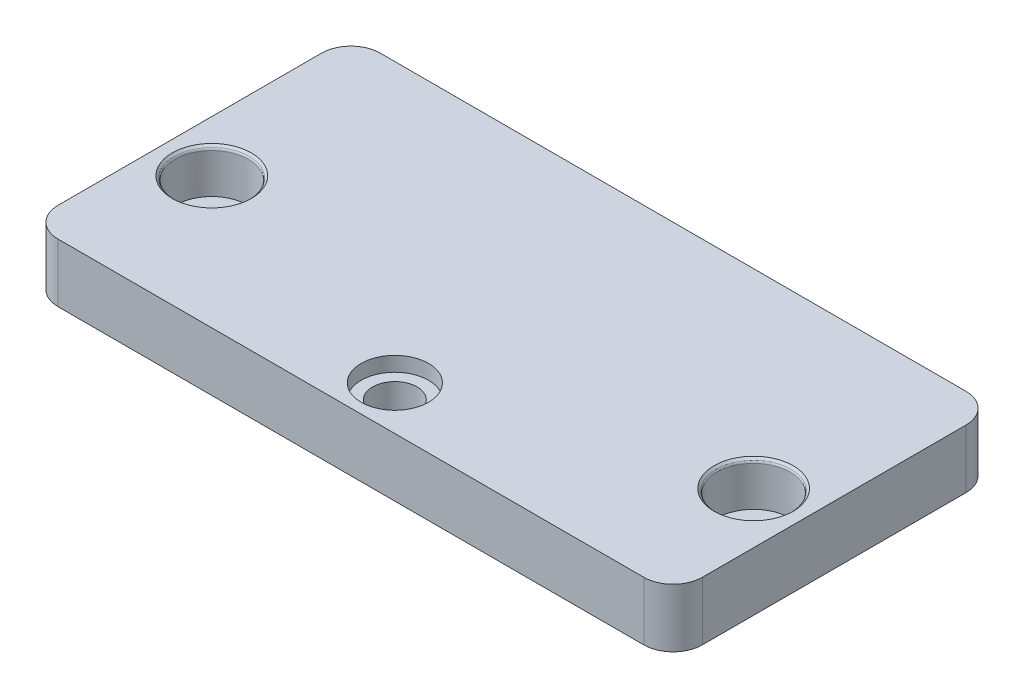
ISO-10303-21;
HEADER;
FILE_DESCRIPTION(('STEP AP214'),'2;1');
FILE_NAME('part.step','',(''),(''),'','','');
FILE_SCHEMA(('AUTOMOTIVE_DESIGN { 1 0 10303 214 1 1 1 1 }'));
ENDSEC;
DATA;
#1=APPLICATION_CONTEXT('core data for automotive mechanical design processes');
#2=APPLICATION_PROTOCOL_DEFINITION('international standard','automotive_design',2000,#1);
#3=PRODUCT_CONTEXT('',#1,'mechanical');
#4=PRODUCT('Part','Part','',(#3));
#5=PRODUCT_RELATED_PRODUCT_CATEGORY('part','',(#4));
#6=PRODUCT_DEFINITION_FORMATION('','',#4);
#7=PRODUCT_DEFINITION_CONTEXT('part definition',#1,'design');
#8=PRODUCT_DEFINITION('design','',#6,#7);
#9=PRODUCT_DEFINITION_SHAPE('','',#8);
#10=(LENGTH_UNIT() NAMED_UNIT(*) SI_UNIT(.MILLI.,.METRE.));
#11=(NAMED_UNIT(*) PLANE_ANGLE_UNIT() SI_UNIT($,.RADIAN.));
#12=(NAMED_UNIT(*) SI_UNIT($,.STERADIAN.) SOLID_ANGLE_UNIT());
#13=UNCERTAINTY_MEASURE_WITH_UNIT(LENGTH_MEASURE(1.E-05),#10,'distance_accuracy_value','');
#14=(GEOMETRIC_REPRESENTATION_CONTEXT(3) GLOBAL_UNCERTAINTY_ASSIGNED_CONTEXT((#13)) GLOBAL_UNIT_ASSIGNED_CONTEXT((#10,
#11,#12)) REPRESENTATION_CONTEXT('',''));
#15=CARTESIAN_POINT('',(0.,0.,0.));
#16=DIRECTION('',(0.,0.,1.));
#17=DIRECTION('',(1.,0.,0.));
#18=AXIS2_PLACEMENT_3D('',#15,#16,#17);
#19=CARTESIAN_POINT('',(0.,20.,0.));
#20=DIRECTION('',(1.,0.,0.));
#21=DIRECTION('',(0.,0.,-1.));
#22=AXIS2_PLACEMENT_3D('',#19,#20,#21);
#23=PLANE('',#22);
#24=DIRECTION('',(0.,0.,1.));
#25=VECTOR('',#24,1.);
#26=CARTESIAN_POINT('',(0.,0.,0.));
#27=LINE('',#26,#25);
#28=CARTESIAN_POINT('',(0.,0.,-100.));
#29=VERTEX_POINT('',#28);
#30=CARTESIAN_POINT('',(0.,0.,-10.));
#31=VERTEX_POINT('',#30);
#32=EDGE_CURVE('E222',#29,#31,#27,.T.);
#33=ORIENTED_EDGE('',*,*,#32,.T.);
#34=DIRECTION('',(0.,-1.,0.));
#35=VECTOR('',#34,1.);
#36=CARTESIAN_POINT('',(0.,20.,-10.));
#37=LINE('',#36,#35);
#38=CARTESIAN_POINT('',(0.,20.,-10.));
#39=VERTEX_POINT('',#38);
#40=EDGE_CURVE('E11',#31,#39,#37,.F.);
#41=ORIENTED_EDGE('',*,*,#40,.T.);
#42=DIRECTION('',(0.,0.,1.));
#43=VECTOR('',#42,1.);
#44=CARTESIAN_POINT('',(0.,20.,0.));
#45=LINE('',#44,#43);
#46=CARTESIAN_POINT('',(0.,20.,-100.));
#47=VERTEX_POINT('',#46);
#48=EDGE_CURVE('E145',#47,#39,#45,.T.);
#49=ORIENTED_EDGE('',*,*,#48,.F.);
#50=DIRECTION('',(0.,-1.,0.));
#51=VECTOR('',#50,1.);
#52=CARTESIAN_POINT('',(0.,20.,-100.));
#53=LINE('',#52,#51);
#54=EDGE_CURVE('E58',#47,#29,#53,.T.);
#55=ORIENTED_EDGE('',*,*,#54,.T.);
#56=EDGE_LOOP('',(#33,#41,#49,#55));
#57=FACE_BOUND('',#56,.T.);
#58=ADVANCED_FACE('F49',(#57),#23,.F.);
#59=CARTESIAN_POINT('',(0.,20.,0.));
#60=DIRECTION('',(0.,0.,-1.));
#61=DIRECTION('',(-1.,0.,0.));
#62=AXIS2_PLACEMENT_3D('',#59,#60,#61);
#63=PLANE('',#62);
#64=DIRECTION('',(1.,0.,0.));
#65=VECTOR('',#64,1.);
#66=CARTESIAN_POINT('',(0.,0.,0.));
#67=LINE('',#66,#65);
#68=CARTESIAN_POINT('',(10.,0.,0.));
#69=VERTEX_POINT('',#68);
#70=CARTESIAN_POINT('',(210.,0.,0.));
#71=VERTEX_POINT('',#70);
#72=EDGE_CURVE('E152',#69,#71,#67,.T.);
#73=ORIENTED_EDGE('',*,*,#72,.T.);
#74=DIRECTION('',(0.,-1.,0.));
#75=VECTOR('',#74,1.);
#76=CARTESIAN_POINT('',(210.,20.,0.));
#77=LINE('',#76,#75);
#78=CARTESIAN_POINT('',(210.,20.,0.));
#79=VERTEX_POINT('',#78);
#80=EDGE_CURVE('E65',#71,#79,#77,.F.);
#81=ORIENTED_EDGE('',*,*,#80,.T.);
#82=DIRECTION('',(1.,0.,0.));
#83=VECTOR('',#82,1.);
#84=CARTESIAN_POINT('',(0.,20.,0.));
#85=LINE('',#84,#83);
#86=CARTESIAN_POINT('',(10.,20.,0.));
#87=VERTEX_POINT('',#86);
#88=EDGE_CURVE('E150',#87,#79,#85,.T.);
#89=ORIENTED_EDGE('',*,*,#88,.F.);
#90=DIRECTION('',(0.,-1.,0.));
#91=VECTOR('',#90,1.);
#92=CARTESIAN_POINT('',(10.,20.,0.));
#93=LINE('',#92,#91);
#94=EDGE_CURVE('E211',#87,#69,#93,.T.);
#95=ORIENTED_EDGE('',*,*,#94,.T.);
#96=EDGE_LOOP('',(#73,#81,#89,#95));
#97=FACE_BOUND('',#96,.T.);
#98=ADVANCED_FACE('F282',(#97),#63,.F.);
#99=CARTESIAN_POINT('',(220.,20.,0.));
#100=DIRECTION('',(-1.,0.,0.));
#101=DIRECTION('',(0.,0.,1.));
#102=AXIS2_PLACEMENT_3D('',#99,#100,#101);
#103=PLANE('',#102);
#104=DIRECTION('',(0.,0.,-1.));
#105=VECTOR('',#104,1.);
#106=CARTESIAN_POINT('',(220.,0.,0.));
#107=LINE('',#106,#105);
#108=CARTESIAN_POINT('',(220.,0.,-10.));
#109=VERTEX_POINT('',#108);
#110=CARTESIAN_POINT('',(220.,0.,-100.));
#111=VERTEX_POINT('',#110);
#112=EDGE_CURVE('E146',#109,#111,#107,.T.);
#113=ORIENTED_EDGE('',*,*,#112,.T.);
#114=DIRECTION('',(0.,-1.,0.));
#115=VECTOR('',#114,1.);
#116=CARTESIAN_POINT('',(220.,20.,-100.));
#117=LINE('',#116,#115);
#118=CARTESIAN_POINT('',(220.,20.,-100.));
#119=VERTEX_POINT('',#118);
#120=EDGE_CURVE('E121',#111,#119,#117,.F.);
#121=ORIENTED_EDGE('',*,*,#120,.T.);
#122=DIRECTION('',(0.,0.,-1.));
#123=VECTOR('',#122,1.);
#124=CARTESIAN_POINT('',(220.,20.,0.));
#125=LINE('',#124,#123);
#126=CARTESIAN_POINT('',(220.,20.,-10.));
#127=VERTEX_POINT('',#126);
#128=EDGE_CURVE('E238',#127,#119,#125,.T.);
#129=ORIENTED_EDGE('',*,*,#128,.F.);
#130=DIRECTION('',(0.,-1.,0.));
#131=VECTOR('',#130,1.);
#132=CARTESIAN_POINT('',(220.,20.,-10.));
#133=LINE('',#132,#131);
#134=EDGE_CURVE('E127',#127,#109,#133,.T.);
#135=ORIENTED_EDGE('',*,*,#134,.T.);
#136=EDGE_LOOP('',(#113,#121,#129,#135));
#137=FACE_BOUND('',#136,.T.);
#138=ADVANCED_FACE('F279',(#137),#103,.F.);
#139=CARTESIAN_POINT('',(0.,20.,-110.));
#140=DIRECTION('',(0.,0.,1.));
#141=DIRECTION('',(1.,0.,0.));
#142=AXIS2_PLACEMENT_3D('',#139,#140,#141);
#143=PLANE('',#142);
#144=DIRECTION('',(-1.,0.,0.));
#145=VECTOR('',#144,1.);
#146=CARTESIAN_POINT('',(0.,20.,-110.));
#147=LINE('',#146,#145);
#148=CARTESIAN_POINT('',(210.,20.,-110.));
#149=VERTEX_POINT('',#148);
#150=CARTESIAN_POINT('',(10.,20.,-110.));
#151=VERTEX_POINT('',#150);
#152=EDGE_CURVE('E137',#149,#151,#147,.T.);
#153=ORIENTED_EDGE('',*,*,#152,.F.);
#154=DIRECTION('',(0.,-1.,0.));
#155=VECTOR('',#154,1.);
#156=CARTESIAN_POINT('',(210.,20.,-110.));
#157=LINE('',#156,#155);
#158=CARTESIAN_POINT('',(210.,0.,-110.));
#159=VERTEX_POINT('',#158);
#160=EDGE_CURVE('E120',#149,#159,#157,.T.);
#161=ORIENTED_EDGE('',*,*,#160,.T.);
#162=DIRECTION('',(-1.,0.,0.));
#163=VECTOR('',#162,1.);
#164=CARTESIAN_POINT('',(0.,0.,-110.));
#165=LINE('',#164,#163);
#166=CARTESIAN_POINT('',(10.,0.,-110.));
#167=VERTEX_POINT('',#166);
#168=EDGE_CURVE('E134',#159,#167,#165,.T.);
#169=ORIENTED_EDGE('',*,*,#168,.T.);
#170=DIRECTION('',(0.,-1.,0.));
#171=VECTOR('',#170,1.);
#172=CARTESIAN_POINT('',(10.,20.,-110.));
#173=LINE('',#172,#171);
#174=EDGE_CURVE('E140',#167,#151,#173,.F.);
#175=ORIENTED_EDGE('',*,*,#174,.T.);
#176=EDGE_LOOP('',(#153,#161,#169,#175));
#177=FACE_BOUND('',#176,.T.);
#178=ADVANCED_FACE('F133',(#177),#143,.F.);
#179=CARTESIAN_POINT('',(0.,20.,0.));
#180=DIRECTION('',(0.,-1.,0.));
#181=DIRECTION('',(0.,0.,-1.));
#182=AXIS2_PLACEMENT_3D('',#179,#180,#181);
#183=PLANE('',#182);
#184=CARTESIAN_POINT('',(110.,20.,-15.));
#185=DIRECTION('',(0.,1.,0.));
#186=DIRECTION('',(0.,0.,1.));
#187=AXIS2_PLACEMENT_3D('',#184,#185,#186);
#188=CIRCLE('',#187,11.5);
#189=CARTESIAN_POINT('',(110.,20.,-3.50000000000001));
#190=VERTEX_POINT('',#189);
#191=EDGE_CURVE('E250',#190,#190,#188,.T.);
#192=ORIENTED_EDGE('',*,*,#191,.F.);
#193=EDGE_LOOP('',(#192));
#194=FACE_BOUND('',#193,.T.);
#195=CARTESIAN_POINT('',(202.5,20.,-45.));
#196=DIRECTION('',(0.,-1.,0.));
#197=DIRECTION('',(0.,0.,-1.));
#198=AXIS2_PLACEMENT_3D('',#195,#196,#197);
#199=CIRCLE('',#198,13.4999999999999);
#200=CARTESIAN_POINT('',(202.5,20.,-58.4999999999999));
#201=VERTEX_POINT('',#200);
#202=EDGE_CURVE('E160',#201,#201,#199,.T.);
#203=ORIENTED_EDGE('',*,*,#202,.T.);
#204=EDGE_LOOP('',(#203));
#205=FACE_BOUND('',#204,.T.);
#206=CARTESIAN_POINT('',(17.5,20.,-45.));
#207=DIRECTION('',(0.,-1.,0.));
#208=DIRECTION('',(0.,0.,-1.));
#209=AXIS2_PLACEMENT_3D('',#206,#207,#208);
#210=CIRCLE('',#209,13.4999999999999);
#211=CARTESIAN_POINT('',(17.5,20.,-58.4999999999999));
#212=VERTEX_POINT('',#211);
#213=EDGE_CURVE('E156',#212,#212,#210,.T.);
#214=ORIENTED_EDGE('',*,*,#213,.T.);
#215=EDGE_LOOP('',(#214));
#216=FACE_BOUND('',#215,.T.);
#217=ORIENTED_EDGE('',*,*,#128,.T.);
#218=CARTESIAN_POINT('',(210.,20.,-100.));
#219=DIRECTION('',(0.,-1.,0.));
#220=DIRECTION('',(0.,0.,-1.));
#221=AXIS2_PLACEMENT_3D('',#218,#219,#220);
#222=CIRCLE('',#221,10.);
#223=EDGE_CURVE('E208',#119,#149,#222,.F.);
#224=ORIENTED_EDGE('',*,*,#223,.T.);
#225=ORIENTED_EDGE('',*,*,#152,.T.);
#226=CARTESIAN_POINT('',(10.,20.,-100.));
#227=DIRECTION('',(0.,-1.,0.));
#228=DIRECTION('',(0.,0.,-1.));
#229=AXIS2_PLACEMENT_3D('',#226,#227,#228);
#230=CIRCLE('',#229,10.);
#231=EDGE_CURVE('E200',#151,#47,#230,.F.);
#232=ORIENTED_EDGE('',*,*,#231,.T.);
#233=ORIENTED_EDGE('',*,*,#48,.T.);
#234=CARTESIAN_POINT('',(10.,20.,-10.));
#235=DIRECTION('',(0.,-1.,0.));
#236=DIRECTION('',(0.,0.,-1.));
#237=AXIS2_PLACEMENT_3D('',#234,#235,#236);
#238=CIRCLE('',#237,10.);
#239=EDGE_CURVE('E72',#39,#87,#238,.F.);
#240=ORIENTED_EDGE('',*,*,#239,.T.);
#241=ORIENTED_EDGE('',*,*,#88,.T.);
#242=CARTESIAN_POINT('',(210.,20.,-10.));
#243=DIRECTION('',(0.,-1.,0.));
#244=DIRECTION('',(0.,0.,-1.));
#245=AXIS2_PLACEMENT_3D('',#242,#243,#244);
#246=CIRCLE('',#245,10.);
#247=EDGE_CURVE('E205',#79,#127,#246,.F.);
#248=ORIENTED_EDGE('',*,*,#247,.T.);
#249=EDGE_LOOP('',(#217,#224,#225,#232,#233,#240,#241,#248));
#250=FACE_BOUND('',#249,.T.);
#251=ADVANCED_FACE('F268',(#194,#205,#216,#250),#183,.F.);
#252=CARTESIAN_POINT('',(0.,0.,0.));
#253=DIRECTION('',(0.,-1.,0.));
#254=DIRECTION('',(0.,0.,-1.));
#255=AXIS2_PLACEMENT_3D('',#252,#253,#254);
#256=PLANE('',#255);
#257=ORIENTED_EDGE('',*,*,#168,.F.);
#258=CARTESIAN_POINT('',(210.,0.,-100.));
#259=DIRECTION('',(0.,-1.,0.));
#260=DIRECTION('',(0.,0.,-1.));
#261=AXIS2_PLACEMENT_3D('',#258,#259,#260);
#262=CIRCLE('',#261,10.);
#263=EDGE_CURVE('E116',#159,#111,#262,.T.);
#264=ORIENTED_EDGE('',*,*,#263,.T.);
#265=ORIENTED_EDGE('',*,*,#112,.F.);
#266=CARTESIAN_POINT('',(210.,0.,-10.));
#267=DIRECTION('',(0.,-1.,0.));
#268=DIRECTION('',(0.,0.,-1.));
#269=AXIS2_PLACEMENT_3D('',#266,#267,#268);
#270=CIRCLE('',#269,10.);
#271=EDGE_CURVE('E128',#109,#71,#270,.T.);
#272=ORIENTED_EDGE('',*,*,#271,.T.);
#273=ORIENTED_EDGE('',*,*,#72,.F.);
#274=CARTESIAN_POINT('',(10.,0.,-10.));
#275=DIRECTION('',(0.,-1.,0.));
#276=DIRECTION('',(0.,0.,-1.));
#277=AXIS2_PLACEMENT_3D('',#274,#275,#276);
#278=CIRCLE('',#277,10.);
#279=EDGE_CURVE('E190',#69,#31,#278,.T.);
#280=ORIENTED_EDGE('',*,*,#279,.T.);
#281=ORIENTED_EDGE('',*,*,#32,.F.);
#282=CARTESIAN_POINT('',(10.,0.,-100.));
#283=DIRECTION('',(0.,-1.,0.));
#284=DIRECTION('',(0.,0.,-1.));
#285=AXIS2_PLACEMENT_3D('',#282,#283,#284);
#286=CIRCLE('',#285,10.);
#287=EDGE_CURVE('E139',#29,#167,#286,.T.);
#288=ORIENTED_EDGE('',*,*,#287,.T.);
#289=EDGE_LOOP('',(#257,#264,#265,#272,#273,#280,#281,#288));
#290=FACE_BOUND('',#289,.T.);
#291=ADVANCED_FACE('F142',(#290),#256,.T.);
#292=CARTESIAN_POINT('',(202.5,5.,-45.));
#293=DIRECTION('',(0.,1.,0.));
#294=DIRECTION('',(0.,0.,1.));
#295=AXIS2_PLACEMENT_3D('',#292,#293,#294);
#296=CYLINDRICAL_SURFACE('',#295,12.5);
#297=CARTESIAN_POINT('',(202.5,18.585786437627,-45.));
#298=DIRECTION('',(0.,-1.,0.));
#299=DIRECTION('',(0.,0.,-1.));
#300=AXIS2_PLACEMENT_3D('',#297,#298,#299);
#301=CIRCLE('',#300,12.5);
#302=CARTESIAN_POINT('',(202.5,18.585786437627,-57.5));
#303=VERTEX_POINT('',#302);
#304=EDGE_CURVE('E164',#303,#303,#301,.F.);
#305=ORIENTED_EDGE('',*,*,#304,.T.);
#306=EDGE_LOOP('',(#305));
#307=FACE_BOUND('',#306,.T.);
#308=CARTESIAN_POINT('',(202.5,5.,-45.));
#309=DIRECTION('',(0.,1.,0.));
#310=DIRECTION('',(0.,0.,-1.));
#311=AXIS2_PLACEMENT_3D('',#308,#309,#310);
#312=CIRCLE('',#311,12.5);
#313=CARTESIAN_POINT('',(202.5,5.,-57.5));
#314=VERTEX_POINT('',#313);
#315=EDGE_CURVE('E233',#314,#314,#312,.T.);
#316=ORIENTED_EDGE('',*,*,#315,.F.);
#317=EDGE_LOOP('',(#316));
#318=FACE_BOUND('',#317,.T.);
#319=ADVANCED_FACE('F412',(#307,#318),#296,.F.);
#320=CARTESIAN_POINT('',(202.5,5.,-45.));
#321=DIRECTION('',(0.,-1.,0.));
#322=DIRECTION('',(0.,0.,-1.));
#323=AXIS2_PLACEMENT_3D('',#320,#321,#322);
#324=PLANE('',#323);
#325=ORIENTED_EDGE('',*,*,#315,.T.);
#326=EDGE_LOOP('',(#325));
#327=FACE_BOUND('',#326,.T.);
#328=ADVANCED_FACE('F403',(#327),#324,.F.);
#329=CARTESIAN_POINT('',(17.5,5.,-45.));
#330=DIRECTION('',(0.,1.,0.));
#331=DIRECTION('',(0.,0.,1.));
#332=AXIS2_PLACEMENT_3D('',#329,#330,#331);
#333=CYLINDRICAL_SURFACE('',#332,12.5);
#334=CARTESIAN_POINT('',(17.5,18.585786437627,-45.));
#335=DIRECTION('',(0.,-1.,0.));
#336=DIRECTION('',(0.,0.,-1.));
#337=AXIS2_PLACEMENT_3D('',#334,#335,#336);
#338=CIRCLE('',#337,12.5);
#339=CARTESIAN_POINT('',(17.5,18.585786437627,-57.5));
#340=VERTEX_POINT('',#339);
#341=EDGE_CURVE('E172',#340,#340,#338,.F.);
#342=ORIENTED_EDGE('',*,*,#341,.T.);
#343=EDGE_LOOP('',(#342));
#344=FACE_BOUND('',#343,.T.);
#345=CARTESIAN_POINT('',(17.5,5.,-45.));
#346=DIRECTION('',(0.,1.,0.));
#347=DIRECTION('',(0.,0.,1.));
#348=AXIS2_PLACEMENT_3D('',#345,#346,#347);
#349=CIRCLE('',#348,12.5);
#350=CARTESIAN_POINT('',(17.5,5.,-32.5));
#351=VERTEX_POINT('',#350);
#352=EDGE_CURVE('E228',#351,#351,#349,.T.);
#353=ORIENTED_EDGE('',*,*,#352,.F.);
#354=EDGE_LOOP('',(#353));
#355=FACE_BOUND('',#354,.T.);
#356=ADVANCED_FACE('F394',(#344,#355),#333,.F.);
#357=CARTESIAN_POINT('',(17.5,5.,-45.));
#358=DIRECTION('',(0.,1.,0.));
#359=DIRECTION('',(0.,0.,1.));
#360=AXIS2_PLACEMENT_3D('',#357,#358,#359);
#361=PLANE('',#360);
#362=ORIENTED_EDGE('',*,*,#352,.T.);
#363=EDGE_LOOP('',(#362));
#364=FACE_BOUND('',#363,.T.);
#365=ADVANCED_FACE('F307',(#364),#361,.T.);
#366=CARTESIAN_POINT('',(202.5,19.0000000000001,-45.));
#367=DIRECTION('',(0.,1.,0.));
#368=DIRECTION('',(0.,0.,1.));
#369=AXIS2_PLACEMENT_3D('',#366,#367,#368);
#370=CONICAL_SURFACE('',#369,12.5,0.785398163397441);
#371=CARTESIAN_POINT('',(202.5,19.2928932188135,-45.));
#372=DIRECTION('',(0.,1.,0.));
#373=DIRECTION('',(0.,0.,1.));
#374=AXIS2_PLACEMENT_3D('',#371,#372,#373);
#375=CIRCLE('',#374,12.7928932188135);
#376=CARTESIAN_POINT('',(202.5,19.2928932188135,-32.2071067811865));
#377=VERTEX_POINT('',#376);
#378=EDGE_CURVE('E168',#377,#377,#375,.F.);
#379=ORIENTED_EDGE('',*,*,#378,.T.);
#380=EDGE_LOOP('',(#379));
#381=FACE_BOUND('',#380,.T.);
#382=ORIENTED_EDGE('',*,*,#202,.F.);
#383=EDGE_LOOP('',(#382));
#384=FACE_BOUND('',#383,.T.);
#385=ADVANCED_FACE('F300',(#381,#384),#370,.F.);
#386=CARTESIAN_POINT('',(17.5,19.0000000000001,-45.));
#387=DIRECTION('',(0.,1.,0.));
#388=DIRECTION('',(0.,0.,1.));
#389=AXIS2_PLACEMENT_3D('',#386,#387,#388);
#390=CONICAL_SURFACE('',#389,12.5,0.785398163397441);
#391=CARTESIAN_POINT('',(17.5,19.2928932188135,-45.));
#392=DIRECTION('',(0.,1.,0.));
#393=DIRECTION('',(0.,0.,1.));
#394=AXIS2_PLACEMENT_3D('',#391,#392,#393);
#395=CIRCLE('',#394,12.7928932188135);
#396=CARTESIAN_POINT('',(17.5,19.2928932188135,-32.2071067811865));
#397=VERTEX_POINT('',#396);
#398=EDGE_CURVE('E176',#397,#397,#395,.F.);
#399=ORIENTED_EDGE('',*,*,#398,.T.);
#400=EDGE_LOOP('',(#399));
#401=FACE_BOUND('',#400,.T.);
#402=ORIENTED_EDGE('',*,*,#213,.F.);
#403=EDGE_LOOP('',(#402));
#404=FACE_BOUND('',#403,.T.);
#405=ADVANCED_FACE('F306',(#401,#404),#390,.F.);
#406=CARTESIAN_POINT('',(202.5,18.585786437627,-45.));
#407=DIRECTION('',(0.,-1.,0.));
#408=DIRECTION('',(0.,0.,-1.));
#409=AXIS2_PLACEMENT_3D('',#406,#407,#408);
#410=TOROIDAL_SURFACE('',#409,13.5,1.);
#411=ORIENTED_EDGE('',*,*,#378,.F.);
#412=EDGE_LOOP('',(#411));
#413=FACE_BOUND('',#412,.T.);
#414=ORIENTED_EDGE('',*,*,#304,.F.);
#415=EDGE_LOOP('',(#414));
#416=FACE_BOUND('',#415,.T.);
#417=ADVANCED_FACE('F313',(#413,#416),#410,.T.);
#418=CARTESIAN_POINT('',(17.5,18.585786437627,-45.));
#419=DIRECTION('',(0.,-1.,0.));
#420=DIRECTION('',(0.,0.,-1.));
#421=AXIS2_PLACEMENT_3D('',#418,#419,#420);
#422=TOROIDAL_SURFACE('',#421,13.5,1.);
#423=ORIENTED_EDGE('',*,*,#398,.F.);
#424=EDGE_LOOP('',(#423));
#425=FACE_BOUND('',#424,.T.);
#426=ORIENTED_EDGE('',*,*,#341,.F.);
#427=EDGE_LOOP('',(#426));
#428=FACE_BOUND('',#427,.T.);
#429=ADVANCED_FACE('F317',(#425,#428),#422,.T.);
#430=CARTESIAN_POINT('',(110.,15.,-15.));
#431=DIRECTION('',(0.,1.,0.));
#432=DIRECTION('',(0.,0.,1.));
#433=AXIS2_PLACEMENT_3D('',#430,#431,#432);
#434=PLANE('',#433);
#435=CARTESIAN_POINT('',(110.,15.,-15.));
#436=DIRECTION('',(0.,1.,0.));
#437=DIRECTION('',(0.,0.,1.));
#438=AXIS2_PLACEMENT_3D('',#435,#436,#437);
#439=CIRCLE('',#438,11.5);
#440=CARTESIAN_POINT('',(110.,15.,-3.50000000000001));
#441=VERTEX_POINT('',#440);
#442=EDGE_CURVE('E185',#441,#441,#439,.T.);
#443=ORIENTED_EDGE('',*,*,#442,.T.);
#444=EDGE_LOOP('',(#443));
#445=FACE_BOUND('',#444,.T.);
#446=CARTESIAN_POINT('',(110.,15.,-15.));
#447=DIRECTION('',(0.,1.,0.));
#448=DIRECTION('',(0.,0.,1.));
#449=AXIS2_PLACEMENT_3D('',#446,#447,#448);
#450=CIRCLE('',#449,7.59999999999999);
#451=CARTESIAN_POINT('',(110.,15.,-7.40000000000001));
#452=VERTEX_POINT('',#451);
#453=EDGE_CURVE('E180',#452,#452,#450,.F.);
#454=ORIENTED_EDGE('',*,*,#453,.T.);
#455=EDGE_LOOP('',(#454));
#456=FACE_BOUND('',#455,.T.);
#457=ADVANCED_FACE('F258',(#445,#456),#434,.T.);
#458=CARTESIAN_POINT('',(110.,15.,-15.));
#459=DIRECTION('',(0.,1.,0.));
#460=DIRECTION('',(0.,0.,1.));
#461=AXIS2_PLACEMENT_3D('',#458,#459,#460);
#462=CYLINDRICAL_SURFACE('',#461,11.5);
#463=ORIENTED_EDGE('',*,*,#442,.F.);
#464=EDGE_LOOP('',(#463));
#465=FACE_BOUND('',#464,.T.);
#466=ORIENTED_EDGE('',*,*,#191,.T.);
#467=EDGE_LOOP('',(#466));
#468=FACE_BOUND('',#467,.T.);
#469=ADVANCED_FACE('F261',(#465,#468),#462,.F.);
#470=CARTESIAN_POINT('',(110.,5.,-15.));
#471=DIRECTION('',(0.,1.,0.));
#472=DIRECTION('',(0.,0.,1.));
#473=AXIS2_PLACEMENT_3D('',#470,#471,#472);
#474=PLANE('',#473);
#475=CARTESIAN_POINT('',(110.,5.,-15.));
#476=DIRECTION('',(0.,1.,0.));
#477=DIRECTION('',(0.,0.,1.));
#478=AXIS2_PLACEMENT_3D('',#475,#476,#477);
#479=CIRCLE('',#478,7.59999999999999);
#480=CARTESIAN_POINT('',(110.,5.,-7.40000000000001));
#481=VERTEX_POINT('',#480);
#482=EDGE_CURVE('E184',#481,#481,#479,.T.);
#483=ORIENTED_EDGE('',*,*,#482,.T.);
#484=EDGE_LOOP('',(#483));
#485=FACE_BOUND('',#484,.T.);
#486=ADVANCED_FACE('F264',(#485),#474,.T.);
#487=CARTESIAN_POINT('',(110.,5.,-15.));
#488=DIRECTION('',(0.,1.,0.));
#489=DIRECTION('',(0.,0.,1.));
#490=AXIS2_PLACEMENT_3D('',#487,#488,#489);
#491=CYLINDRICAL_SURFACE('',#490,7.59999999999999);
#492=ORIENTED_EDGE('',*,*,#482,.F.);
#493=EDGE_LOOP('',(#492));
#494=FACE_BOUND('',#493,.T.);
#495=ORIENTED_EDGE('',*,*,#453,.F.);
#496=EDGE_LOOP('',(#495));
#497=FACE_BOUND('',#496,.T.);
#498=ADVANCED_FACE('F324',(#494,#497),#491,.F.);
#499=CARTESIAN_POINT('',(210.,20.,-100.));
#500=DIRECTION('',(0.,-1.,0.));
#501=DIRECTION('',(0.,0.,-1.));
#502=AXIS2_PLACEMENT_3D('',#499,#500,#501);
#503=CYLINDRICAL_SURFACE('',#502,10.);
#504=ORIENTED_EDGE('',*,*,#223,.F.);
#505=ORIENTED_EDGE('',*,*,#120,.F.);
#506=ORIENTED_EDGE('',*,*,#263,.F.);
#507=ORIENTED_EDGE('',*,*,#160,.F.);
#508=EDGE_LOOP('',(#504,#505,#506,#507));
#509=FACE_BOUND('',#508,.T.);
#510=ADVANCED_FACE('F119',(#509),#503,.T.);
#511=CARTESIAN_POINT('',(210.,20.,-10.));
#512=DIRECTION('',(0.,-1.,0.));
#513=DIRECTION('',(0.,0.,-1.));
#514=AXIS2_PLACEMENT_3D('',#511,#512,#513);
#515=CYLINDRICAL_SURFACE('',#514,10.);
#516=ORIENTED_EDGE('',*,*,#247,.F.);
#517=ORIENTED_EDGE('',*,*,#80,.F.);
#518=ORIENTED_EDGE('',*,*,#271,.F.);
#519=ORIENTED_EDGE('',*,*,#134,.F.);
#520=EDGE_LOOP('',(#516,#517,#518,#519));
#521=FACE_BOUND('',#520,.T.);
#522=ADVANCED_FACE('F281',(#521),#515,.T.);
#523=CARTESIAN_POINT('',(10.,20.,-10.));
#524=DIRECTION('',(0.,-1.,0.));
#525=DIRECTION('',(0.,0.,-1.));
#526=AXIS2_PLACEMENT_3D('',#523,#524,#525);
#527=CYLINDRICAL_SURFACE('',#526,10.);
#528=ORIENTED_EDGE('',*,*,#239,.F.);
#529=ORIENTED_EDGE('',*,*,#40,.F.);
#530=ORIENTED_EDGE('',*,*,#279,.F.);
#531=ORIENTED_EDGE('',*,*,#94,.F.);
#532=EDGE_LOOP('',(#528,#529,#530,#531));
#533=FACE_BOUND('',#532,.T.);
#534=ADVANCED_FACE('F285',(#533),#527,.T.);
#535=CARTESIAN_POINT('',(10.,20.,-100.));
#536=DIRECTION('',(0.,-1.,0.));
#537=DIRECTION('',(0.,0.,-1.));
#538=AXIS2_PLACEMENT_3D('',#535,#536,#537);
#539=CYLINDRICAL_SURFACE('',#538,10.);
#540=ORIENTED_EDGE('',*,*,#231,.F.);
#541=ORIENTED_EDGE('',*,*,#174,.F.);
#542=ORIENTED_EDGE('',*,*,#287,.F.);
#543=ORIENTED_EDGE('',*,*,#54,.F.);
#544=EDGE_LOOP('',(#540,#541,#542,#543));
#545=FACE_BOUND('',#544,.T.);
#546=ADVANCED_FACE('F51',(#545),#539,.T.);
#547=CLOSED_SHELL('',(#58,#98,#138,#178,#251,#291,#319,#328,#356,#365,#385,#405,#417,#429,#457,
#469,#486,#498,#510,#522,#534,#546));
#548=MANIFOLD_SOLID_BREP('B2',#547);
#549=ADVANCED_BREP_SHAPE_REPRESENTATION('',(#18,#548),#14);
#550=SHAPE_DEFINITION_REPRESENTATION(#9,#549);
ENDSEC;
END-ISO-10303-21;
